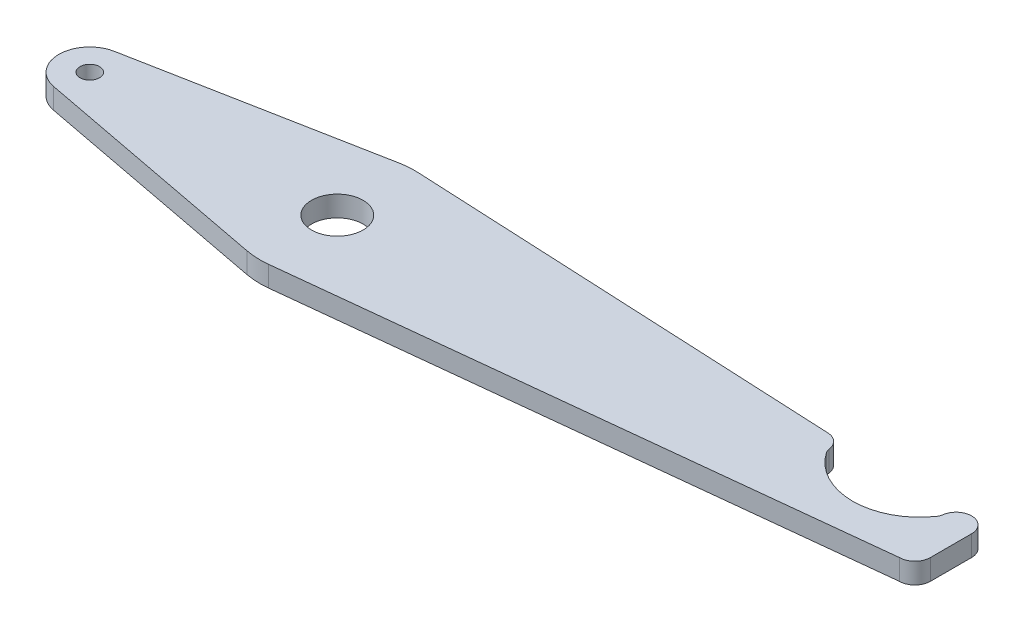
ISO-10303-21;
HEADER;
FILE_DESCRIPTION(('STEP AP214'),'2;1');
FILE_NAME('part.step','',(''),(''),'','','');
FILE_SCHEMA(('AUTOMOTIVE_DESIGN { 1 0 10303 214 1 1 1 1 }'));
ENDSEC;
DATA;
#1=APPLICATION_CONTEXT('core data for automotive mechanical design processes');
#2=APPLICATION_PROTOCOL_DEFINITION('international standard','automotive_design',2000,#1);
#3=PRODUCT_CONTEXT('',#1,'mechanical');
#4=PRODUCT('Part','Part','',(#3));
#5=PRODUCT_RELATED_PRODUCT_CATEGORY('part','',(#4));
#6=PRODUCT_DEFINITION_FORMATION('','',#4);
#7=PRODUCT_DEFINITION_CONTEXT('part definition',#1,'design');
#8=PRODUCT_DEFINITION('design','',#6,#7);
#9=PRODUCT_DEFINITION_SHAPE('','',#8);
#10=(LENGTH_UNIT() NAMED_UNIT(*) SI_UNIT(.MILLI.,.METRE.));
#11=(NAMED_UNIT(*) PLANE_ANGLE_UNIT() SI_UNIT($,.RADIAN.));
#12=(NAMED_UNIT(*) SI_UNIT($,.STERADIAN.) SOLID_ANGLE_UNIT());
#13=UNCERTAINTY_MEASURE_WITH_UNIT(LENGTH_MEASURE(1.E-05),#10,'distance_accuracy_value','');
#14=(GEOMETRIC_REPRESENTATION_CONTEXT(3) GLOBAL_UNCERTAINTY_ASSIGNED_CONTEXT((#13)) GLOBAL_UNIT_ASSIGNED_CONTEXT((#10,
#11,#12)) REPRESENTATION_CONTEXT('',''));
#15=CARTESIAN_POINT('',(0.,0.,0.));
#16=DIRECTION('',(0.,0.,1.));
#17=DIRECTION('',(1.,0.,0.));
#18=AXIS2_PLACEMENT_3D('',#15,#16,#17);
#19=CARTESIAN_POINT('',(1.27751076579549,1.5875,11.837514743635));
#20=DIRECTION('',(-0.107297492140304,0.,-0.99422696009533));
#21=DIRECTION('',(-0.99422696009533,0.,0.107297492140304));
#22=AXIS2_PLACEMENT_3D('',#19,#20,#21);
#23=PLANE('',#22);
#24=DIRECTION('',(0.99422696009533,0.,-0.107297492140304));
#25=VECTOR('',#24,1.);
#26=CARTESIAN_POINT('',(1.27751076579549,-1.5875,11.837514743635));
#27=LINE('',#26,#25);
#28=CARTESIAN_POINT('',(1.27751076579549,-1.5875,11.837514743635));
#29=VERTEX_POINT('',#28);
#30=CARTESIAN_POINT('',(88.9,-1.5875,2.38125));
#31=VERTEX_POINT('',#30);
#32=EDGE_CURVE('E158',#29,#31,#27,.T.);
#33=ORIENTED_EDGE('',*,*,#32,.T.);
#34=DIRECTION('',(0.,-1.,0.));
#35=VECTOR('',#34,1.);
#36=CARTESIAN_POINT('',(88.9,1.5875,2.38125));
#37=LINE('',#36,#35);
#38=CARTESIAN_POINT('',(88.9,1.5875,2.38125));
#39=VERTEX_POINT('',#38);
#40=EDGE_CURVE('E139',#39,#31,#37,.T.);
#41=ORIENTED_EDGE('',*,*,#40,.F.);
#42=DIRECTION('',(0.99422696009533,0.,-0.107297492140304));
#43=VECTOR('',#42,1.);
#44=CARTESIAN_POINT('',(1.27751076579549,1.5875,11.837514743635));
#45=LINE('',#44,#43);
#46=CARTESIAN_POINT('',(1.27751076579549,1.5875,11.837514743635));
#47=VERTEX_POINT('',#46);
#48=EDGE_CURVE('E145',#47,#39,#45,.T.);
#49=ORIENTED_EDGE('',*,*,#48,.F.);
#50=DIRECTION('',(0.,-1.,0.));
#51=VECTOR('',#50,1.);
#52=CARTESIAN_POINT('',(1.27751076579549,1.5875,11.837514743635));
#53=LINE('',#52,#51);
#54=EDGE_CURVE('E223',#47,#29,#53,.T.);
#55=ORIENTED_EDGE('',*,*,#54,.T.);
#56=EDGE_LOOP('',(#33,#41,#49,#55));
#57=FACE_BOUND('',#56,.T.);
#58=ADVANCED_FACE('F35',(#57),#23,.F.);
#59=CARTESIAN_POINT('',(88.9,1.5875,0.));
#60=DIRECTION('',(0.,-1.,0.));
#61=DIRECTION('',(0.,0.,-1.));
#62=AXIS2_PLACEMENT_3D('',#59,#60,#61);
#63=CYLINDRICAL_SURFACE('',#62,2.38125);
#64=CARTESIAN_POINT('',(88.9,-1.5875,0.));
#65=DIRECTION('',(0.,1.,0.));
#66=DIRECTION('',(0.,0.,1.));
#67=AXIS2_PLACEMENT_3D('',#64,#65,#66);
#68=CIRCLE('',#67,2.38125);
#69=CARTESIAN_POINT('',(91.28125,-1.5875,0.));
#70=VERTEX_POINT('',#69);
#71=EDGE_CURVE('E225',#31,#70,#68,.T.);
#72=ORIENTED_EDGE('',*,*,#71,.T.);
#73=DIRECTION('',(0.,-1.,0.));
#74=VECTOR('',#73,1.);
#75=CARTESIAN_POINT('',(91.28125,1.5875,0.));
#76=LINE('',#75,#74);
#77=CARTESIAN_POINT('',(91.28125,1.5875,0.));
#78=VERTEX_POINT('',#77);
#79=EDGE_CURVE('E142',#78,#70,#76,.T.);
#80=ORIENTED_EDGE('',*,*,#79,.F.);
#81=CARTESIAN_POINT('',(88.9,1.5875,0.));
#82=DIRECTION('',(0.,1.,0.));
#83=DIRECTION('',(0.,0.,1.));
#84=AXIS2_PLACEMENT_3D('',#81,#82,#83);
#85=CIRCLE('',#84,2.38125);
#86=EDGE_CURVE('E135',#39,#78,#85,.T.);
#87=ORIENTED_EDGE('',*,*,#86,.F.);
#88=ORIENTED_EDGE('',*,*,#40,.T.);
#89=EDGE_LOOP('',(#72,#80,#87,#88));
#90=FACE_BOUND('',#89,.T.);
#91=ADVANCED_FACE('F137',(#90),#63,.T.);
#92=CARTESIAN_POINT('',(91.28125,1.5875,0.));
#93=DIRECTION('',(-1.,0.,0.));
#94=DIRECTION('',(0.,0.,1.));
#95=AXIS2_PLACEMENT_3D('',#92,#93,#94);
#96=PLANE('',#95);
#97=DIRECTION('',(0.,0.,-1.));
#98=VECTOR('',#97,1.);
#99=CARTESIAN_POINT('',(91.28125,-1.5875,0.));
#100=LINE('',#99,#98);
#101=CARTESIAN_POINT('',(91.28125,-1.5875,-6.35));
#102=VERTEX_POINT('',#101);
#103=EDGE_CURVE('E227',#70,#102,#100,.T.);
#104=ORIENTED_EDGE('',*,*,#103,.T.);
#105=DIRECTION('',(0.,-1.,0.));
#106=VECTOR('',#105,1.);
#107=CARTESIAN_POINT('',(91.28125,1.5875,-6.35));
#108=LINE('',#107,#106);
#109=CARTESIAN_POINT('',(91.28125,1.5875,-6.35));
#110=VERTEX_POINT('',#109);
#111=EDGE_CURVE('E163',#110,#102,#108,.T.);
#112=ORIENTED_EDGE('',*,*,#111,.F.);
#113=DIRECTION('',(0.,0.,-1.));
#114=VECTOR('',#113,1.);
#115=CARTESIAN_POINT('',(91.28125,1.5875,0.));
#116=LINE('',#115,#114);
#117=EDGE_CURVE('E144',#78,#110,#116,.T.);
#118=ORIENTED_EDGE('',*,*,#117,.F.);
#119=ORIENTED_EDGE('',*,*,#79,.T.);
#120=EDGE_LOOP('',(#104,#112,#118,#119));
#121=FACE_BOUND('',#120,.T.);
#122=ADVANCED_FACE('F278',(#121),#96,.F.);
#123=CARTESIAN_POINT('',(88.9,1.5875,-6.35));
#124=DIRECTION('',(0.,-1.,0.));
#125=DIRECTION('',(0.,0.,-1.));
#126=AXIS2_PLACEMENT_3D('',#123,#124,#125);
#127=CYLINDRICAL_SURFACE('',#126,2.38125);
#128=CARTESIAN_POINT('',(88.9,-1.5875,-6.35));
#129=DIRECTION('',(0.,1.,0.));
#130=DIRECTION('',(0.,0.,1.));
#131=AXIS2_PLACEMENT_3D('',#128,#129,#130);
#132=CIRCLE('',#131,2.38125);
#133=CARTESIAN_POINT('',(86.5400696468577,-1.5875,-6.66793126744269));
#134=VERTEX_POINT('',#133);
#135=EDGE_CURVE('E189',#102,#134,#132,.T.);
#136=ORIENTED_EDGE('',*,*,#135,.T.);
#137=DIRECTION('',(0.,-1.,0.));
#138=VECTOR('',#137,1.);
#139=CARTESIAN_POINT('',(86.5400696468577,1.5875,-6.66793126744269));
#140=LINE('',#139,#138);
#141=CARTESIAN_POINT('',(86.5400696468577,1.5875,-6.66793126744269));
#142=VERTEX_POINT('',#141);
#143=EDGE_CURVE('E169',#134,#142,#140,.F.);
#144=ORIENTED_EDGE('',*,*,#143,.T.);
#145=CARTESIAN_POINT('',(88.9,1.5875,-6.35));
#146=DIRECTION('',(0.,1.,0.));
#147=DIRECTION('',(0.,0.,1.));
#148=AXIS2_PLACEMENT_3D('',#145,#146,#147);
#149=CIRCLE('',#148,2.38125);
#150=EDGE_CURVE('E204',#110,#142,#149,.T.);
#151=ORIENTED_EDGE('',*,*,#150,.F.);
#152=ORIENTED_EDGE('',*,*,#111,.T.);
#153=EDGE_LOOP('',(#136,#144,#151,#152));
#154=FACE_BOUND('',#153,.T.);
#155=ADVANCED_FACE('F269',(#154),#127,.T.);
#156=CARTESIAN_POINT('',(77.7875,1.5875,-11.8459846434773));
#157=DIRECTION('',(0.,-1.,0.));
#158=DIRECTION('',(0.,0.,-1.));
#159=AXIS2_PLACEMENT_3D('',#156,#157,#158);
#160=CYLINDRICAL_SURFACE('',#159,10.3170041079685);
#161=CARTESIAN_POINT('',(77.7875,1.5875,-11.8459846434773));
#162=DIRECTION('',(0.,1.,0.));
#163=DIRECTION('',(0.,0.,1.));
#164=AXIS2_PLACEMENT_3D('',#161,#162,#163);
#165=CIRCLE('',#164,10.3170041079685);
#166=CARTESIAN_POINT('',(69.302632056313,1.5875,-5.97677773435991));
#167=VERTEX_POINT('',#166);
#168=CARTESIAN_POINT('',(86.272367943687,1.5875,-5.97677773435991));
#169=VERTEX_POINT('',#168);
#170=EDGE_CURVE('E200',#167,#169,#165,.T.);
#171=ORIENTED_EDGE('',*,*,#170,.T.);
#172=DIRECTION('',(0.,-1.,0.));
#173=VECTOR('',#172,1.);
#174=CARTESIAN_POINT('',(86.272367943687,1.5875,-5.97677773435991));
#175=LINE('',#174,#173);
#176=CARTESIAN_POINT('',(86.272367943687,-1.5875,-5.97677773435991));
#177=VERTEX_POINT('',#176);
#178=EDGE_CURVE('E161',#169,#177,#175,.T.);
#179=ORIENTED_EDGE('',*,*,#178,.T.);
#180=CARTESIAN_POINT('',(77.7875,-1.5875,-11.8459846434773));
#181=DIRECTION('',(0.,1.,0.));
#182=DIRECTION('',(0.,0.,1.));
#183=AXIS2_PLACEMENT_3D('',#180,#181,#182);
#184=CIRCLE('',#183,10.3170041079685);
#185=CARTESIAN_POINT('',(69.302632056313,-1.5875,-5.97677773435991));
#186=VERTEX_POINT('',#185);
#187=EDGE_CURVE('E182',#186,#177,#184,.T.);
#188=ORIENTED_EDGE('',*,*,#187,.F.);
#189=DIRECTION('',(0.,-1.,0.));
#190=VECTOR('',#189,1.);
#191=CARTESIAN_POINT('',(69.302632056313,1.5875,-5.97677773435991));
#192=LINE('',#191,#190);
#193=EDGE_CURVE('E159',#186,#167,#192,.F.);
#194=ORIENTED_EDGE('',*,*,#193,.T.);
#195=EDGE_LOOP('',(#171,#179,#188,#194));
#196=FACE_BOUND('',#195,.T.);
#197=ADVANCED_FACE('F187',(#196),#160,.F.);
#198=CARTESIAN_POINT('',(66.675,1.5875,-6.35));
#199=DIRECTION('',(0.,-1.,0.));
#200=DIRECTION('',(0.,0.,-1.));
#201=AXIS2_PLACEMENT_3D('',#198,#199,#200);
#202=CYLINDRICAL_SURFACE('',#201,2.38125);
#203=CARTESIAN_POINT('',(66.675,1.5875,-6.35));
#204=DIRECTION('',(0.,1.,0.));
#205=DIRECTION('',(0.,0.,1.));
#206=AXIS2_PLACEMENT_3D('',#203,#204,#205);
#207=CIRCLE('',#206,2.38125);
#208=CARTESIAN_POINT('',(69.0349303531423,1.5875,-6.66793126744269));
#209=VERTEX_POINT('',#208);
#210=CARTESIAN_POINT('',(66.675,1.5875,-8.73125));
#211=VERTEX_POINT('',#210);
#212=EDGE_CURVE('E195',#209,#211,#207,.T.);
#213=ORIENTED_EDGE('',*,*,#212,.F.);
#214=DIRECTION('',(0.,-1.,0.));
#215=VECTOR('',#214,1.);
#216=CARTESIAN_POINT('',(69.0349303531423,1.5875,-6.66793126744269));
#217=LINE('',#216,#215);
#218=CARTESIAN_POINT('',(69.0349303531423,-1.5875,-6.66793126744269));
#219=VERTEX_POINT('',#218);
#220=EDGE_CURVE('E171',#209,#219,#217,.T.);
#221=ORIENTED_EDGE('',*,*,#220,.T.);
#222=CARTESIAN_POINT('',(66.675,-1.5875,-6.35));
#223=DIRECTION('',(0.,1.,0.));
#224=DIRECTION('',(0.,0.,1.));
#225=AXIS2_PLACEMENT_3D('',#222,#223,#224);
#226=CIRCLE('',#225,2.38125);
#227=CARTESIAN_POINT('',(66.675,-1.5875,-8.73125));
#228=VERTEX_POINT('',#227);
#229=EDGE_CURVE('E184',#219,#228,#226,.T.);
#230=ORIENTED_EDGE('',*,*,#229,.T.);
#231=DIRECTION('',(0.,-1.,0.));
#232=VECTOR('',#231,1.);
#233=CARTESIAN_POINT('',(66.675,1.5875,-8.73125));
#234=LINE('',#233,#232);
#235=EDGE_CURVE('E196',#211,#228,#234,.T.);
#236=ORIENTED_EDGE('',*,*,#235,.F.);
#237=EDGE_LOOP('',(#213,#221,#230,#236));
#238=FACE_BOUND('',#237,.T.);
#239=ADVANCED_FACE('F192',(#238),#202,.T.);
#240=CARTESIAN_POINT('',(0.568744163864299,1.5875,-11.8926582032181));
#241=DIRECTION('',(0.0477685386972639,0.,-0.998858431766348));
#242=DIRECTION('',(-0.998858431766348,0.,-0.0477685386972639));
#243=AXIS2_PLACEMENT_3D('',#240,#241,#242);
#244=PLANE('',#243);
#245=DIRECTION('',(0.998858431766348,0.,0.0477685386972639));
#246=VECTOR('',#245,1.);
#247=CARTESIAN_POINT('',(0.568744163864299,-1.5875,-11.8926582032181));
#248=LINE('',#247,#246);
#249=CARTESIAN_POINT('',(0.568744163864298,-1.5875,-11.8926582032181));
#250=VERTEX_POINT('',#249);
#251=EDGE_CURVE('E232',#250,#228,#248,.T.);
#252=ORIENTED_EDGE('',*,*,#251,.F.);
#253=DIRECTION('',(0.,-1.,0.));
#254=VECTOR('',#253,1.);
#255=CARTESIAN_POINT('',(0.568744163864298,1.5875,-11.8926582032181));
#256=LINE('',#255,#254);
#257=CARTESIAN_POINT('',(0.568744163864298,1.5875,-11.8926582032181));
#258=VERTEX_POINT('',#257);
#259=EDGE_CURVE('E262',#258,#250,#256,.T.);
#260=ORIENTED_EDGE('',*,*,#259,.F.);
#261=DIRECTION('',(0.998858431766348,0.,0.0477685386972639));
#262=VECTOR('',#261,1.);
#263=CARTESIAN_POINT('',(0.568744163864299,1.5875,-11.8926582032181));
#264=LINE('',#263,#262);
#265=EDGE_CURVE('E199',#258,#211,#264,.T.);
#266=ORIENTED_EDGE('',*,*,#265,.T.);
#267=ORIENTED_EDGE('',*,*,#235,.T.);
#268=EDGE_LOOP('',(#252,#260,#266,#267));
#269=FACE_BOUND('',#268,.T.);
#270=ADVANCED_FACE('F329',(#269),#244,.T.);
#271=CARTESIAN_POINT('',(0.,1.5875,0.));
#272=DIRECTION('',(0.,-1.,0.));
#273=DIRECTION('',(0.,0.,-1.));
#274=AXIS2_PLACEMENT_3D('',#271,#272,#273);
#275=CYLINDRICAL_SURFACE('',#274,11.90625);
#276=CARTESIAN_POINT('',(0.,-1.5875,0.));
#277=DIRECTION('',(0.,1.,0.));
#278=DIRECTION('',(0.,0.,1.));
#279=AXIS2_PLACEMENT_3D('',#276,#277,#278);
#280=CIRCLE('',#279,11.90625);
#281=CARTESIAN_POINT('',(-2.232421875,-1.5875,-11.6950879276097));
#282=VERTEX_POINT('',#281);
#283=EDGE_CURVE('E234',#250,#282,#280,.T.);
#284=ORIENTED_EDGE('',*,*,#283,.T.);
#285=DIRECTION('',(0.,-1.,0.));
#286=VECTOR('',#285,1.);
#287=CARTESIAN_POINT('',(-2.232421875,1.5875,-11.6950879276097));
#288=LINE('',#287,#286);
#289=CARTESIAN_POINT('',(-2.232421875,1.5875,-11.6950879276097));
#290=VERTEX_POINT('',#289);
#291=EDGE_CURVE('E260',#290,#282,#288,.T.);
#292=ORIENTED_EDGE('',*,*,#291,.F.);
#293=CARTESIAN_POINT('',(0.,1.5875,0.));
#294=DIRECTION('',(0.,1.,0.));
#295=DIRECTION('',(0.,0.,1.));
#296=AXIS2_PLACEMENT_3D('',#293,#294,#295);
#297=CIRCLE('',#296,11.90625);
#298=EDGE_CURVE('E202',#258,#290,#297,.T.);
#299=ORIENTED_EDGE('',*,*,#298,.F.);
#300=ORIENTED_EDGE('',*,*,#259,.T.);
#301=EDGE_LOOP('',(#284,#292,#299,#300));
#302=FACE_BOUND('',#301,.T.);
#303=ADVANCED_FACE('F325',(#302),#275,.T.);
#304=CARTESIAN_POINT('',(-2.232421875,1.5875,-11.6950879276097));
#305=DIRECTION('',(-0.1875,0.,-0.982264602843857));
#306=DIRECTION('',(-0.982264602843857,0.,0.1875));
#307=AXIS2_PLACEMENT_3D('',#304,#305,#306);
#308=PLANE('',#307);
#309=DIRECTION('',(0.982264602843857,0.,-0.1875));
#310=VECTOR('',#309,1.);
#311=CARTESIAN_POINT('',(-2.232421875,-1.5875,-11.6950879276097));
#312=LINE('',#311,#310);
#313=CARTESIAN_POINT('',(-38.99296875,-1.5875,-4.67803517104387));
#314=VERTEX_POINT('',#313);
#315=EDGE_CURVE('E237',#314,#282,#312,.T.);
#316=ORIENTED_EDGE('',*,*,#315,.F.);
#317=DIRECTION('',(0.,-1.,0.));
#318=VECTOR('',#317,1.);
#319=CARTESIAN_POINT('',(-38.99296875,1.5875,-4.67803517104387));
#320=LINE('',#319,#318);
#321=CARTESIAN_POINT('',(-38.99296875,1.5875,-4.67803517104387));
#322=VERTEX_POINT('',#321);
#323=EDGE_CURVE('E258',#322,#314,#320,.T.);
#324=ORIENTED_EDGE('',*,*,#323,.F.);
#325=DIRECTION('',(0.982264602843857,0.,-0.1875));
#326=VECTOR('',#325,1.);
#327=CARTESIAN_POINT('',(-2.232421875,1.5875,-11.6950879276097));
#328=LINE('',#327,#326);
#329=EDGE_CURVE('E209',#322,#290,#328,.T.);
#330=ORIENTED_EDGE('',*,*,#329,.T.);
#331=ORIENTED_EDGE('',*,*,#291,.T.);
#332=EDGE_LOOP('',(#316,#324,#330,#331));
#333=FACE_BOUND('',#332,.T.);
#334=ADVANCED_FACE('F321',(#333),#308,.T.);
#335=CARTESIAN_POINT('',(-38.1,1.5875,0.));
#336=DIRECTION('',(0.,-1.,0.));
#337=DIRECTION('',(0.,0.,-1.));
#338=AXIS2_PLACEMENT_3D('',#335,#336,#337);
#339=CYLINDRICAL_SURFACE('',#338,4.7625);
#340=CARTESIAN_POINT('',(-38.1,-1.5875,0.));
#341=DIRECTION('',(0.,1.,0.));
#342=DIRECTION('',(0.,0.,1.));
#343=AXIS2_PLACEMENT_3D('',#340,#341,#342);
#344=CIRCLE('',#343,4.7625);
#345=CARTESIAN_POINT('',(-38.99296875,-1.5875,4.67803517104387));
#346=VERTEX_POINT('',#345);
#347=EDGE_CURVE('E240',#314,#346,#344,.T.);
#348=ORIENTED_EDGE('',*,*,#347,.T.);
#349=DIRECTION('',(0.,-1.,0.));
#350=VECTOR('',#349,1.);
#351=CARTESIAN_POINT('',(-38.99296875,1.5875,4.67803517104387));
#352=LINE('',#351,#350);
#353=CARTESIAN_POINT('',(-38.99296875,1.5875,4.67803517104387));
#354=VERTEX_POINT('',#353);
#355=EDGE_CURVE('E255',#354,#346,#352,.T.);
#356=ORIENTED_EDGE('',*,*,#355,.F.);
#357=CARTESIAN_POINT('',(-38.1,1.5875,0.));
#358=DIRECTION('',(0.,1.,0.));
#359=DIRECTION('',(0.,0.,1.));
#360=AXIS2_PLACEMENT_3D('',#357,#358,#359);
#361=CIRCLE('',#360,4.7625);
#362=EDGE_CURVE('E212',#322,#354,#361,.T.);
#363=ORIENTED_EDGE('',*,*,#362,.F.);
#364=ORIENTED_EDGE('',*,*,#323,.T.);
#365=EDGE_LOOP('',(#348,#356,#363,#364));
#366=FACE_BOUND('',#365,.T.);
#367=ADVANCED_FACE('F317',(#366),#339,.T.);
#368=CARTESIAN_POINT('',(-2.232421875,1.5875,11.6950879276097));
#369=DIRECTION('',(0.1875,0.,-0.982264602843857));
#370=DIRECTION('',(-0.982264602843857,0.,-0.1875));
#371=AXIS2_PLACEMENT_3D('',#368,#369,#370);
#372=PLANE('',#371);
#373=DIRECTION('',(0.982264602843857,0.,0.1875));
#374=VECTOR('',#373,1.);
#375=CARTESIAN_POINT('',(-2.232421875,-1.5875,11.6950879276097));
#376=LINE('',#375,#374);
#377=CARTESIAN_POINT('',(-2.232421875,-1.5875,11.6950879276097));
#378=VERTEX_POINT('',#377);
#379=EDGE_CURVE('E242',#346,#378,#376,.T.);
#380=ORIENTED_EDGE('',*,*,#379,.T.);
#381=DIRECTION('',(0.,-1.,0.));
#382=VECTOR('',#381,1.);
#383=CARTESIAN_POINT('',(-2.232421875,1.5875,11.6950879276097));
#384=LINE('',#383,#382);
#385=CARTESIAN_POINT('',(-2.232421875,1.5875,11.6950879276097));
#386=VERTEX_POINT('',#385);
#387=EDGE_CURVE('E252',#386,#378,#384,.T.);
#388=ORIENTED_EDGE('',*,*,#387,.F.);
#389=DIRECTION('',(0.982264602843857,0.,0.1875));
#390=VECTOR('',#389,1.);
#391=CARTESIAN_POINT('',(-2.232421875,1.5875,11.6950879276097));
#392=LINE('',#391,#390);
#393=EDGE_CURVE('E214',#354,#386,#392,.T.);
#394=ORIENTED_EDGE('',*,*,#393,.F.);
#395=ORIENTED_EDGE('',*,*,#355,.T.);
#396=EDGE_LOOP('',(#380,#388,#394,#395));
#397=FACE_BOUND('',#396,.T.);
#398=ADVANCED_FACE('F310',(#397),#372,.F.);
#399=CARTESIAN_POINT('',(0.,1.5875,0.));
#400=DIRECTION('',(0.,-1.,0.));
#401=DIRECTION('',(0.,0.,-1.));
#402=AXIS2_PLACEMENT_3D('',#399,#400,#401);
#403=CYLINDRICAL_SURFACE('',#402,3.96875);
#404=CARTESIAN_POINT('',(0.,1.5875,0.));
#405=DIRECTION('',(0.,1.,0.));
#406=DIRECTION('',(0.,0.,1.));
#407=AXIS2_PLACEMENT_3D('',#404,#405,#406);
#408=CIRCLE('',#407,3.96875);
#409=CARTESIAN_POINT('',(0.,1.5875,3.96875));
#410=VERTEX_POINT('',#409);
#411=EDGE_CURVE('E217',#410,#410,#408,.T.);
#412=ORIENTED_EDGE('',*,*,#411,.T.);
#413=EDGE_LOOP('',(#412));
#414=FACE_BOUND('',#413,.T.);
#415=CARTESIAN_POINT('',(0.,-1.5875,0.));
#416=DIRECTION('',(0.,1.,0.));
#417=DIRECTION('',(0.,0.,1.));
#418=AXIS2_PLACEMENT_3D('',#415,#416,#417);
#419=CIRCLE('',#418,3.96875);
#420=CARTESIAN_POINT('',(0.,-1.5875,3.96875));
#421=VERTEX_POINT('',#420);
#422=EDGE_CURVE('E246',#421,#421,#419,.T.);
#423=ORIENTED_EDGE('',*,*,#422,.F.);
#424=EDGE_LOOP('',(#423));
#425=FACE_BOUND('',#424,.T.);
#426=ADVANCED_FACE('F307',(#414,#425),#403,.F.);
#427=CARTESIAN_POINT('',(0.,1.5875,0.));
#428=DIRECTION('',(0.,-1.,0.));
#429=DIRECTION('',(0.,0.,-1.));
#430=AXIS2_PLACEMENT_3D('',#427,#428,#429);
#431=CYLINDRICAL_SURFACE('',#430,11.90625);
#432=CARTESIAN_POINT('',(0.,-1.5875,0.));
#433=DIRECTION('',(0.,1.,0.));
#434=DIRECTION('',(0.,0.,1.));
#435=AXIS2_PLACEMENT_3D('',#432,#433,#434);
#436=CIRCLE('',#435,11.90625);
#437=EDGE_CURVE('E244',#378,#29,#436,.T.);
#438=ORIENTED_EDGE('',*,*,#437,.T.);
#439=ORIENTED_EDGE('',*,*,#54,.F.);
#440=CARTESIAN_POINT('',(0.,1.5875,0.));
#441=DIRECTION('',(0.,1.,0.));
#442=DIRECTION('',(0.,0.,1.));
#443=AXIS2_PLACEMENT_3D('',#440,#441,#442);
#444=CIRCLE('',#443,11.90625);
#445=EDGE_CURVE('E151',#386,#47,#444,.T.);
#446=ORIENTED_EDGE('',*,*,#445,.F.);
#447=ORIENTED_EDGE('',*,*,#387,.T.);
#448=EDGE_LOOP('',(#438,#439,#446,#447));
#449=FACE_BOUND('',#448,.T.);
#450=ADVANCED_FACE('F305',(#449),#431,.T.);
#451=CARTESIAN_POINT('',(-38.1,1.5875,0.));
#452=DIRECTION('',(0.,-1.,0.));
#453=DIRECTION('',(0.,0.,-1.));
#454=AXIS2_PLACEMENT_3D('',#451,#452,#453);
#455=CYLINDRICAL_SURFACE('',#454,1.5);
#456=CARTESIAN_POINT('',(-38.1,1.5875,0.));
#457=DIRECTION('',(0.,1.,0.));
#458=DIRECTION('',(0.,0.,1.));
#459=AXIS2_PLACEMENT_3D('',#456,#457,#458);
#460=CIRCLE('',#459,1.5);
#461=CARTESIAN_POINT('',(-38.1,1.5875,1.5));
#462=VERTEX_POINT('',#461);
#463=EDGE_CURVE('E220',#462,#462,#460,.T.);
#464=ORIENTED_EDGE('',*,*,#463,.T.);
#465=EDGE_LOOP('',(#464));
#466=FACE_BOUND('',#465,.T.);
#467=CARTESIAN_POINT('',(-38.1,-1.5875,0.));
#468=DIRECTION('',(0.,1.,0.));
#469=DIRECTION('',(0.,0.,1.));
#470=AXIS2_PLACEMENT_3D('',#467,#468,#469);
#471=CIRCLE('',#470,1.5);
#472=CARTESIAN_POINT('',(-38.1,-1.5875,1.5));
#473=VERTEX_POINT('',#472);
#474=EDGE_CURVE('E155',#473,#473,#471,.T.);
#475=ORIENTED_EDGE('',*,*,#474,.F.);
#476=EDGE_LOOP('',(#475));
#477=FACE_BOUND('',#476,.T.);
#478=ADVANCED_FACE('F300',(#466,#477),#455,.F.);
#479=CARTESIAN_POINT('',(0.,1.5875,0.));
#480=DIRECTION('',(0.,1.,0.));
#481=DIRECTION('',(0.,0.,1.));
#482=AXIS2_PLACEMENT_3D('',#479,#480,#481);
#483=PLANE('',#482);
#484=ORIENTED_EDGE('',*,*,#48,.T.);
#485=ORIENTED_EDGE('',*,*,#86,.T.);
#486=ORIENTED_EDGE('',*,*,#117,.T.);
#487=ORIENTED_EDGE('',*,*,#150,.T.);
#488=CARTESIAN_POINT('',(84.9667827447629,1.5875,-6.87988544573781));
#489=DIRECTION('',(0.,1.,0.));
#490=DIRECTION('',(0.,0.,1.));
#491=AXIS2_PLACEMENT_3D('',#488,#489,#490);
#492=CIRCLE('',#491,1.5875);
#493=EDGE_CURVE('E175',#142,#169,#492,.F.);
#494=ORIENTED_EDGE('',*,*,#493,.T.);
#495=ORIENTED_EDGE('',*,*,#170,.F.);
#496=CARTESIAN_POINT('',(70.6082172552371,1.5875,-6.87988544573781));
#497=DIRECTION('',(0.,1.,0.));
#498=DIRECTION('',(0.,0.,1.));
#499=AXIS2_PLACEMENT_3D('',#496,#497,#498);
#500=CIRCLE('',#499,1.5875);
#501=EDGE_CURVE('E11',#167,#209,#500,.F.);
#502=ORIENTED_EDGE('',*,*,#501,.T.);
#503=ORIENTED_EDGE('',*,*,#212,.T.);
#504=ORIENTED_EDGE('',*,*,#265,.F.);
#505=ORIENTED_EDGE('',*,*,#298,.T.);
#506=ORIENTED_EDGE('',*,*,#329,.F.);
#507=ORIENTED_EDGE('',*,*,#362,.T.);
#508=ORIENTED_EDGE('',*,*,#393,.T.);
#509=ORIENTED_EDGE('',*,*,#445,.T.);
#510=EDGE_LOOP('',(#484,#485,#486,#487,#494,#495,#502,#503,#504,#505,#506,#507,#508,#509));
#511=FACE_BOUND('',#510,.T.);
#512=ORIENTED_EDGE('',*,*,#411,.F.);
#513=EDGE_LOOP('',(#512));
#514=FACE_BOUND('',#513,.T.);
#515=ORIENTED_EDGE('',*,*,#463,.F.);
#516=EDGE_LOOP('',(#515));
#517=FACE_BOUND('',#516,.T.);
#518=ADVANCED_FACE('F148',(#511,#514,#517),#483,.T.);
#519=CARTESIAN_POINT('',(0.,-1.5875,0.));
#520=DIRECTION('',(0.,1.,0.));
#521=DIRECTION('',(0.,0.,1.));
#522=AXIS2_PLACEMENT_3D('',#519,#520,#521);
#523=PLANE('',#522);
#524=ORIENTED_EDGE('',*,*,#32,.F.);
#525=ORIENTED_EDGE('',*,*,#437,.F.);
#526=ORIENTED_EDGE('',*,*,#379,.F.);
#527=ORIENTED_EDGE('',*,*,#347,.F.);
#528=ORIENTED_EDGE('',*,*,#315,.T.);
#529=ORIENTED_EDGE('',*,*,#283,.F.);
#530=ORIENTED_EDGE('',*,*,#251,.T.);
#531=ORIENTED_EDGE('',*,*,#229,.F.);
#532=CARTESIAN_POINT('',(70.6082172552371,-1.5875,-6.87988544573781));
#533=DIRECTION('',(0.,1.,0.));
#534=DIRECTION('',(0.,0.,1.));
#535=AXIS2_PLACEMENT_3D('',#532,#533,#534);
#536=CIRCLE('',#535,1.5875);
#537=EDGE_CURVE('E43',#219,#186,#536,.T.);
#538=ORIENTED_EDGE('',*,*,#537,.T.);
#539=ORIENTED_EDGE('',*,*,#187,.T.);
#540=CARTESIAN_POINT('',(84.9667827447629,-1.5875,-6.87988544573781));
#541=DIRECTION('',(0.,1.,0.));
#542=DIRECTION('',(0.,0.,1.));
#543=AXIS2_PLACEMENT_3D('',#540,#541,#542);
#544=CIRCLE('',#543,1.5875);
#545=EDGE_CURVE('E173',#177,#134,#544,.T.);
#546=ORIENTED_EDGE('',*,*,#545,.T.);
#547=ORIENTED_EDGE('',*,*,#135,.F.);
#548=ORIENTED_EDGE('',*,*,#103,.F.);
#549=ORIENTED_EDGE('',*,*,#71,.F.);
#550=EDGE_LOOP('',(#524,#525,#526,#527,#528,#529,#530,#531,#538,#539,#546,#547,#548,#549));
#551=FACE_BOUND('',#550,.T.);
#552=ORIENTED_EDGE('',*,*,#422,.T.);
#553=EDGE_LOOP('',(#552));
#554=FACE_BOUND('',#553,.T.);
#555=ORIENTED_EDGE('',*,*,#474,.T.);
#556=EDGE_LOOP('',(#555));
#557=FACE_BOUND('',#556,.T.);
#558=ADVANCED_FACE('F180',(#551,#554,#557),#523,.F.);
#559=CARTESIAN_POINT('',(84.9667827447629,1.5875,-6.87988544573781));
#560=DIRECTION('',(0.,-1.,0.));
#561=DIRECTION('',(0.,0.,-1.));
#562=AXIS2_PLACEMENT_3D('',#559,#560,#561);
#563=CYLINDRICAL_SURFACE('',#562,1.5875);
#564=ORIENTED_EDGE('',*,*,#493,.F.);
#565=ORIENTED_EDGE('',*,*,#143,.F.);
#566=ORIENTED_EDGE('',*,*,#545,.F.);
#567=ORIENTED_EDGE('',*,*,#178,.F.);
#568=EDGE_LOOP('',(#564,#565,#566,#567));
#569=FACE_BOUND('',#568,.T.);
#570=ADVANCED_FACE('F276',(#569),#563,.F.);
#571=CARTESIAN_POINT('',(70.6082172552371,1.5875,-6.87988544573781));
#572=DIRECTION('',(0.,-1.,0.));
#573=DIRECTION('',(0.,0.,-1.));
#574=AXIS2_PLACEMENT_3D('',#571,#572,#573);
#575=CYLINDRICAL_SURFACE('',#574,1.5875);
#576=ORIENTED_EDGE('',*,*,#501,.F.);
#577=ORIENTED_EDGE('',*,*,#193,.F.);
#578=ORIENTED_EDGE('',*,*,#537,.F.);
#579=ORIENTED_EDGE('',*,*,#220,.F.);
#580=EDGE_LOOP('',(#576,#577,#578,#579));
#581=FACE_BOUND('',#580,.T.);
#582=ADVANCED_FACE('F37',(#581),#575,.F.);
#583=CLOSED_SHELL('',(#58,#91,#122,#155,#197,#239,#270,#303,#334,#367,#398,#426,#450,#478,#518,
#558,#570,#582));
#584=MANIFOLD_SOLID_BREP('B2',#583);
#585=ADVANCED_BREP_SHAPE_REPRESENTATION('',(#18,#584),#14);
#586=SHAPE_DEFINITION_REPRESENTATION(#9,#585);
ENDSEC;
END-ISO-10303-21;
